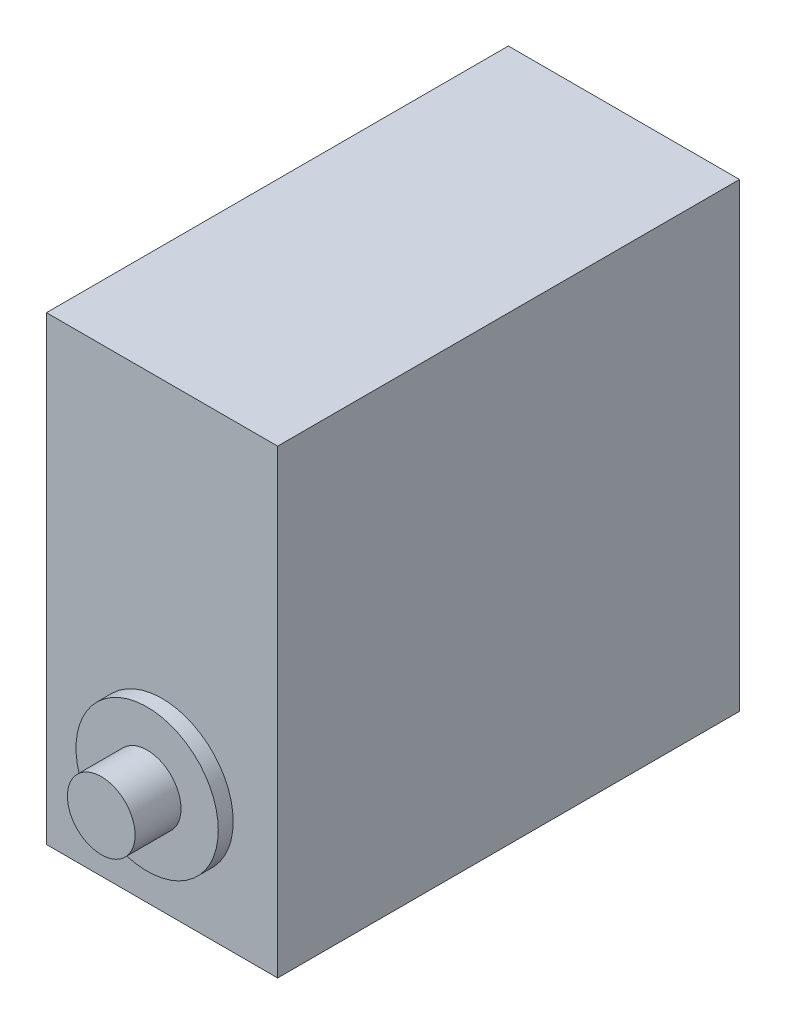
ISO-10303-21;
HEADER;
FILE_DESCRIPTION(('STEP AP214'),'2;1');
FILE_NAME('part.step','',(''),(''),'','','');
FILE_SCHEMA(('AUTOMOTIVE_DESIGN { 1 0 10303 214 1 1 1 1 }'));
ENDSEC;
DATA;
#1=APPLICATION_CONTEXT('core data for automotive mechanical design processes');
#2=APPLICATION_PROTOCOL_DEFINITION('international standard','automotive_design',2000,#1);
#3=PRODUCT_CONTEXT('',#1,'mechanical');
#4=PRODUCT('Part','Part','',(#3));
#5=PRODUCT_RELATED_PRODUCT_CATEGORY('part','',(#4));
#6=PRODUCT_DEFINITION_FORMATION('','',#4);
#7=PRODUCT_DEFINITION_CONTEXT('part definition',#1,'design');
#8=PRODUCT_DEFINITION('design','',#6,#7);
#9=PRODUCT_DEFINITION_SHAPE('','',#8);
#10=(LENGTH_UNIT() NAMED_UNIT(*) SI_UNIT(.MILLI.,.METRE.));
#11=(NAMED_UNIT(*) PLANE_ANGLE_UNIT() SI_UNIT($,.RADIAN.));
#12=(NAMED_UNIT(*) SI_UNIT($,.STERADIAN.) SOLID_ANGLE_UNIT());
#13=UNCERTAINTY_MEASURE_WITH_UNIT(LENGTH_MEASURE(1.E-05),#10,'distance_accuracy_value','');
#14=(GEOMETRIC_REPRESENTATION_CONTEXT(3) GLOBAL_UNCERTAINTY_ASSIGNED_CONTEXT((#13)) GLOBAL_UNIT_ASSIGNED_CONTEXT((#10,
#11,#12)) REPRESENTATION_CONTEXT('',''));
#15=CARTESIAN_POINT('',(0.,0.,0.));
#16=DIRECTION('',(0.,0.,1.));
#17=DIRECTION('',(1.,0.,0.));
#18=AXIS2_PLACEMENT_3D('',#15,#16,#17);
#19=CARTESIAN_POINT('',(10.075,20.0750000000001,20.13));
#20=DIRECTION('',(0.,-1.,0.));
#21=DIRECTION('',(0.,0.,-1.));
#22=AXIS2_PLACEMENT_3D('',#19,#20,#21);
#23=PLANE('',#22);
#24=DIRECTION('',(-1.,0.,0.));
#25=VECTOR('',#24,1.);
#26=CARTESIAN_POINT('',(10.075,20.0750000000001,-20.13));
#27=LINE('',#26,#25);
#28=CARTESIAN_POINT('',(10.075,20.0750000000001,-20.13));
#29=VERTEX_POINT('',#28);
#30=CARTESIAN_POINT('',(-10.075,20.0750000000001,-20.13));
#31=VERTEX_POINT('',#30);
#32=EDGE_CURVE('E106',#29,#31,#27,.T.);
#33=ORIENTED_EDGE('',*,*,#32,.T.);
#34=DIRECTION('',(0.,0.,-1.));
#35=VECTOR('',#34,1.);
#36=CARTESIAN_POINT('',(-10.075,20.0750000000001,20.13));
#37=LINE('',#36,#35);
#38=CARTESIAN_POINT('',(-10.075,20.0750000000001,20.13));
#39=VERTEX_POINT('',#38);
#40=EDGE_CURVE('E45',#39,#31,#37,.T.);
#41=ORIENTED_EDGE('',*,*,#40,.F.);
#42=DIRECTION('',(-1.,0.,0.));
#43=VECTOR('',#42,1.);
#44=CARTESIAN_POINT('',(10.075,20.0750000000001,20.13));
#45=LINE('',#44,#43);
#46=CARTESIAN_POINT('',(10.075,20.0750000000001,20.13));
#47=VERTEX_POINT('',#46);
#48=EDGE_CURVE('E91',#47,#39,#45,.T.);
#49=ORIENTED_EDGE('',*,*,#48,.F.);
#50=DIRECTION('',(0.,0.,-1.));
#51=VECTOR('',#50,1.);
#52=CARTESIAN_POINT('',(10.075,20.0750000000001,20.13));
#53=LINE('',#52,#51);
#54=EDGE_CURVE('E105',#47,#29,#53,.T.);
#55=ORIENTED_EDGE('',*,*,#54,.T.);
#56=EDGE_LOOP('',(#33,#41,#49,#55));
#57=FACE_BOUND('',#56,.T.);
#58=ADVANCED_FACE('F39',(#57),#23,.F.);
#59=CARTESIAN_POINT('',(-10.075,-20.0749999999999,20.13));
#60=DIRECTION('',(1.,0.,0.));
#61=DIRECTION('',(0.,0.,-1.));
#62=AXIS2_PLACEMENT_3D('',#59,#60,#61);
#63=PLANE('',#62);
#64=DIRECTION('',(0.,-1.,0.));
#65=VECTOR('',#64,1.);
#66=CARTESIAN_POINT('',(-10.075,-20.0749999999999,-20.13));
#67=LINE('',#66,#65);
#68=CARTESIAN_POINT('',(-10.075,-20.0749999999999,-20.13));
#69=VERTEX_POINT('',#68);
#70=EDGE_CURVE('E98',#31,#69,#67,.T.);
#71=ORIENTED_EDGE('',*,*,#70,.T.);
#72=DIRECTION('',(0.,0.,-1.));
#73=VECTOR('',#72,1.);
#74=CARTESIAN_POINT('',(-10.075,-20.0749999999999,20.13));
#75=LINE('',#74,#73);
#76=CARTESIAN_POINT('',(-10.075,-20.0749999999999,20.13));
#77=VERTEX_POINT('',#76);
#78=EDGE_CURVE('E96',#77,#69,#75,.T.);
#79=ORIENTED_EDGE('',*,*,#78,.F.);
#80=DIRECTION('',(0.,-1.,0.));
#81=VECTOR('',#80,1.);
#82=CARTESIAN_POINT('',(-10.075,-20.0749999999999,20.13));
#83=LINE('',#82,#81);
#84=EDGE_CURVE('E86',#39,#77,#83,.T.);
#85=ORIENTED_EDGE('',*,*,#84,.F.);
#86=ORIENTED_EDGE('',*,*,#40,.T.);
#87=EDGE_LOOP('',(#71,#79,#85,#86));
#88=FACE_BOUND('',#87,.T.);
#89=ADVANCED_FACE('F100',(#88),#63,.F.);
#90=CARTESIAN_POINT('',(10.075,-20.0749999999999,20.13));
#91=DIRECTION('',(0.,1.,0.));
#92=DIRECTION('',(0.,0.,1.));
#93=AXIS2_PLACEMENT_3D('',#90,#91,#92);
#94=PLANE('',#93);
#95=DIRECTION('',(1.,0.,0.));
#96=VECTOR('',#95,1.);
#97=CARTESIAN_POINT('',(10.075,-20.0749999999999,-20.13));
#98=LINE('',#97,#96);
#99=CARTESIAN_POINT('',(10.075,-20.0749999999999,-20.13));
#100=VERTEX_POINT('',#99);
#101=EDGE_CURVE('E74',#69,#100,#98,.T.);
#102=ORIENTED_EDGE('',*,*,#101,.T.);
#103=DIRECTION('',(0.,0.,-1.));
#104=VECTOR('',#103,1.);
#105=CARTESIAN_POINT('',(10.075,-20.0749999999999,20.13));
#106=LINE('',#105,#104);
#107=CARTESIAN_POINT('',(10.075,-20.0749999999999,20.13));
#108=VERTEX_POINT('',#107);
#109=EDGE_CURVE('E97',#108,#100,#106,.T.);
#110=ORIENTED_EDGE('',*,*,#109,.F.);
#111=DIRECTION('',(1.,0.,0.));
#112=VECTOR('',#111,1.);
#113=CARTESIAN_POINT('',(10.075,-20.0749999999999,20.13));
#114=LINE('',#113,#112);
#115=EDGE_CURVE('E93',#77,#108,#114,.T.);
#116=ORIENTED_EDGE('',*,*,#115,.F.);
#117=ORIENTED_EDGE('',*,*,#78,.T.);
#118=EDGE_LOOP('',(#102,#110,#116,#117));
#119=FACE_BOUND('',#118,.T.);
#120=ADVANCED_FACE('F99',(#119),#94,.F.);
#121=CARTESIAN_POINT('',(10.075,-20.0749999999999,20.13));
#122=DIRECTION('',(-1.,0.,0.));
#123=DIRECTION('',(0.,0.,1.));
#124=AXIS2_PLACEMENT_3D('',#121,#122,#123);
#125=PLANE('',#124);
#126=DIRECTION('',(0.,1.,0.));
#127=VECTOR('',#126,1.);
#128=CARTESIAN_POINT('',(10.075,-20.0749999999999,-20.13));
#129=LINE('',#128,#127);
#130=EDGE_CURVE('E77',#100,#29,#129,.T.);
#131=ORIENTED_EDGE('',*,*,#130,.T.);
#132=ORIENTED_EDGE('',*,*,#54,.F.);
#133=DIRECTION('',(0.,1.,0.));
#134=VECTOR('',#133,1.);
#135=CARTESIAN_POINT('',(10.075,-20.0749999999999,20.13));
#136=LINE('',#135,#134);
#137=EDGE_CURVE('E60',#108,#47,#136,.T.);
#138=ORIENTED_EDGE('',*,*,#137,.F.);
#139=ORIENTED_EDGE('',*,*,#109,.T.);
#140=EDGE_LOOP('',(#131,#132,#138,#139));
#141=FACE_BOUND('',#140,.T.);
#142=ADVANCED_FACE('F111',(#141),#125,.F.);
#143=CARTESIAN_POINT('',(0.,0.,20.13));
#144=DIRECTION('',(0.,0.,-1.));
#145=DIRECTION('',(-1.,0.,0.));
#146=AXIS2_PLACEMENT_3D('',#143,#144,#145);
#147=PLANE('',#146);
#148=CARTESIAN_POINT('',(0.,-10.2049999999999,20.13));
#149=DIRECTION('',(0.,0.,1.));
#150=DIRECTION('',(1.,0.,0.));
#151=AXIS2_PLACEMENT_3D('',#148,#149,#150);
#152=CIRCLE('',#151,6.20000000000001);
#153=CARTESIAN_POINT('',(6.20000000000001,-10.2049999999999,20.13));
#154=VERTEX_POINT('',#153);
#155=EDGE_CURVE('E117',#154,#154,#152,.T.);
#156=ORIENTED_EDGE('',*,*,#155,.F.);
#157=EDGE_LOOP('',(#156));
#158=FACE_BOUND('',#157,.T.);
#159=ORIENTED_EDGE('',*,*,#48,.T.);
#160=ORIENTED_EDGE('',*,*,#84,.T.);
#161=ORIENTED_EDGE('',*,*,#115,.T.);
#162=ORIENTED_EDGE('',*,*,#137,.T.);
#163=EDGE_LOOP('',(#159,#160,#161,#162));
#164=FACE_BOUND('',#163,.T.);
#165=ADVANCED_FACE('F90',(#158,#164),#147,.F.);
#166=CARTESIAN_POINT('',(0.,0.,-20.13));
#167=DIRECTION('',(0.,0.,-1.));
#168=DIRECTION('',(-1.,0.,0.));
#169=AXIS2_PLACEMENT_3D('',#166,#167,#168);
#170=PLANE('',#169);
#171=CARTESIAN_POINT('',(0.,-10.2049999999999,-20.13));
#172=DIRECTION('',(0.,0.,1.));
#173=DIRECTION('',(1.,0.,0.));
#174=AXIS2_PLACEMENT_3D('',#171,#172,#173);
#175=CIRCLE('',#174,6.20000000000001);
#176=CARTESIAN_POINT('',(6.20000000000001,-10.2049999999999,-20.13));
#177=VERTEX_POINT('',#176);
#178=EDGE_CURVE('E127',#177,#177,#175,.T.);
#179=ORIENTED_EDGE('',*,*,#178,.T.);
#180=EDGE_LOOP('',(#179));
#181=FACE_BOUND('',#180,.T.);
#182=ORIENTED_EDGE('',*,*,#32,.F.);
#183=ORIENTED_EDGE('',*,*,#130,.F.);
#184=ORIENTED_EDGE('',*,*,#101,.F.);
#185=ORIENTED_EDGE('',*,*,#70,.F.);
#186=EDGE_LOOP('',(#182,#183,#184,#185));
#187=FACE_BOUND('',#186,.T.);
#188=ADVANCED_FACE('F120',(#181,#187),#170,.T.);
#189=CARTESIAN_POINT('',(0.,-10.2049999999999,21.43));
#190=DIRECTION('',(0.,0.,-1.));
#191=DIRECTION('',(-1.,0.,0.));
#192=AXIS2_PLACEMENT_3D('',#189,#190,#191);
#193=CYLINDRICAL_SURFACE('',#192,6.20000000000001);
#194=CARTESIAN_POINT('',(0.,-10.2049999999999,21.43));
#195=DIRECTION('',(0.,0.,1.));
#196=DIRECTION('',(1.,0.,0.));
#197=AXIS2_PLACEMENT_3D('',#194,#195,#196);
#198=CIRCLE('',#197,6.20000000000001);
#199=CARTESIAN_POINT('',(6.20000000000001,-10.2049999999999,21.43));
#200=VERTEX_POINT('',#199);
#201=EDGE_CURVE('E108',#200,#200,#198,.T.);
#202=ORIENTED_EDGE('',*,*,#201,.F.);
#203=EDGE_LOOP('',(#202));
#204=FACE_BOUND('',#203,.T.);
#205=ORIENTED_EDGE('',*,*,#155,.T.);
#206=EDGE_LOOP('',(#205));
#207=FACE_BOUND('',#206,.T.);
#208=ADVANCED_FACE('F153',(#204,#207),#193,.T.);
#209=CARTESIAN_POINT('',(0.,-10.2049999999999,21.43));
#210=DIRECTION('',(0.,0.,1.));
#211=DIRECTION('',(1.,0.,0.));
#212=AXIS2_PLACEMENT_3D('',#209,#210,#211);
#213=PLANE('',#212);
#214=CARTESIAN_POINT('',(0.,-10.2049999999999,21.43));
#215=DIRECTION('',(0.,0.,1.));
#216=DIRECTION('',(1.,0.,0.));
#217=AXIS2_PLACEMENT_3D('',#214,#215,#216);
#218=CIRCLE('',#217,2.95);
#219=CARTESIAN_POINT('',(2.95,-10.2049999999999,21.43));
#220=VERTEX_POINT('',#219);
#221=EDGE_CURVE('E11',#220,#220,#218,.T.);
#222=ORIENTED_EDGE('',*,*,#221,.F.);
#223=EDGE_LOOP('',(#222));
#224=FACE_BOUND('',#223,.T.);
#225=ORIENTED_EDGE('',*,*,#201,.T.);
#226=EDGE_LOOP('',(#225));
#227=FACE_BOUND('',#226,.T.);
#228=ADVANCED_FACE('F149',(#224,#227),#213,.T.);
#229=CARTESIAN_POINT('',(0.,-10.2049999999999,-21.43));
#230=DIRECTION('',(0.,0.,1.));
#231=DIRECTION('',(1.,0.,0.));
#232=AXIS2_PLACEMENT_3D('',#229,#230,#231);
#233=CYLINDRICAL_SURFACE('',#232,6.20000000000001);
#234=CARTESIAN_POINT('',(0.,-10.2049999999999,-21.43));
#235=DIRECTION('',(0.,0.,1.));
#236=DIRECTION('',(1.,0.,0.));
#237=AXIS2_PLACEMENT_3D('',#234,#235,#236);
#238=CIRCLE('',#237,6.20000000000001);
#239=CARTESIAN_POINT('',(6.20000000000001,-10.2049999999999,-21.43));
#240=VERTEX_POINT('',#239);
#241=EDGE_CURVE('E121',#240,#240,#238,.T.);
#242=ORIENTED_EDGE('',*,*,#241,.T.);
#243=EDGE_LOOP('',(#242));
#244=FACE_BOUND('',#243,.T.);
#245=ORIENTED_EDGE('',*,*,#178,.F.);
#246=EDGE_LOOP('',(#245));
#247=FACE_BOUND('',#246,.T.);
#248=ADVANCED_FACE('F155',(#244,#247),#233,.T.);
#249=CARTESIAN_POINT('',(0.,-10.2049999999999,-21.43));
#250=DIRECTION('',(0.,0.,-1.));
#251=DIRECTION('',(1.,0.,0.));
#252=AXIS2_PLACEMENT_3D('',#249,#250,#251);
#253=PLANE('',#252);
#254=CARTESIAN_POINT('',(0.,-10.2049999999999,-21.43));
#255=DIRECTION('',(0.,0.,-1.));
#256=DIRECTION('',(-1.,0.,0.));
#257=AXIS2_PLACEMENT_3D('',#254,#255,#256);
#258=CIRCLE('',#257,3.);
#259=CARTESIAN_POINT('',(-3.,-10.2049999999999,-21.43));
#260=VERTEX_POINT('',#259);
#261=EDGE_CURVE('E48',#260,#260,#258,.T.);
#262=ORIENTED_EDGE('',*,*,#261,.F.);
#263=EDGE_LOOP('',(#262));
#264=FACE_BOUND('',#263,.T.);
#265=ORIENTED_EDGE('',*,*,#241,.F.);
#266=EDGE_LOOP('',(#265));
#267=FACE_BOUND('',#266,.T.);
#268=ADVANCED_FACE('F218',(#264,#267),#253,.T.);
#269=CARTESIAN_POINT('',(0.,-10.2049999999999,-25.43));
#270=DIRECTION('',(0.,0.,1.));
#271=DIRECTION('',(1.,0.,0.));
#272=AXIS2_PLACEMENT_3D('',#269,#270,#271);
#273=CYLINDRICAL_SURFACE('',#272,3.);
#274=CARTESIAN_POINT('',(0.,-10.2049999999999,-25.43));
#275=DIRECTION('',(0.,0.,-1.));
#276=DIRECTION('',(-1.,0.,0.));
#277=AXIS2_PLACEMENT_3D('',#274,#275,#276);
#278=CIRCLE('',#277,3.);
#279=CARTESIAN_POINT('',(-3.,-10.2049999999999,-25.43));
#280=VERTEX_POINT('',#279);
#281=EDGE_CURVE('E129',#280,#280,#278,.T.);
#282=ORIENTED_EDGE('',*,*,#281,.F.);
#283=EDGE_LOOP('',(#282));
#284=FACE_BOUND('',#283,.T.);
#285=ORIENTED_EDGE('',*,*,#261,.T.);
#286=EDGE_LOOP('',(#285));
#287=FACE_BOUND('',#286,.T.);
#288=ADVANCED_FACE('F229',(#284,#287),#273,.T.);
#289=CARTESIAN_POINT('',(0.,-10.2049999999999,-25.43));
#290=DIRECTION('',(0.,0.,-1.));
#291=DIRECTION('',(-1.,0.,0.));
#292=AXIS2_PLACEMENT_3D('',#289,#290,#291);
#293=PLANE('',#292);
#294=ORIENTED_EDGE('',*,*,#281,.T.);
#295=EDGE_LOOP('',(#294));
#296=FACE_BOUND('',#295,.T.);
#297=ADVANCED_FACE('F144',(#296),#293,.T.);
#298=CARTESIAN_POINT('',(0.,-10.2049999999999,25.43));
#299=DIRECTION('',(0.,0.,-1.));
#300=DIRECTION('',(-1.,0.,0.));
#301=AXIS2_PLACEMENT_3D('',#298,#299,#300);
#302=CYLINDRICAL_SURFACE('',#301,2.95);
#303=CARTESIAN_POINT('',(0.,-10.2049999999999,25.43));
#304=DIRECTION('',(0.,0.,1.));
#305=DIRECTION('',(1.,0.,0.));
#306=AXIS2_PLACEMENT_3D('',#303,#304,#305);
#307=CIRCLE('',#306,2.95);
#308=CARTESIAN_POINT('',(2.95,-10.2049999999999,25.43));
#309=VERTEX_POINT('',#308);
#310=EDGE_CURVE('E132',#309,#309,#307,.T.);
#311=ORIENTED_EDGE('',*,*,#310,.F.);
#312=EDGE_LOOP('',(#311));
#313=FACE_BOUND('',#312,.T.);
#314=ORIENTED_EDGE('',*,*,#221,.T.);
#315=EDGE_LOOP('',(#314));
#316=FACE_BOUND('',#315,.T.);
#317=ADVANCED_FACE('F142',(#313,#316),#302,.T.);
#318=CARTESIAN_POINT('',(0.,-10.2049999999999,25.43));
#319=DIRECTION('',(0.,0.,1.));
#320=DIRECTION('',(1.,0.,0.));
#321=AXIS2_PLACEMENT_3D('',#318,#319,#320);
#322=PLANE('',#321);
#323=ORIENTED_EDGE('',*,*,#310,.T.);
#324=EDGE_LOOP('',(#323));
#325=FACE_BOUND('',#324,.T.);
#326=ADVANCED_FACE('F136',(#325),#322,.T.);
#327=CLOSED_SHELL('',(#58,#89,#120,#142,#165,#188,#208,#228,#248,#268,#288,#297,#317,#326));
#328=MANIFOLD_SOLID_BREP('B2',#327);
#329=ADVANCED_BREP_SHAPE_REPRESENTATION('',(#18,#328),#14);
#330=SHAPE_DEFINITION_REPRESENTATION(#9,#329);
ENDSEC;
END-ISO-10303-21;
